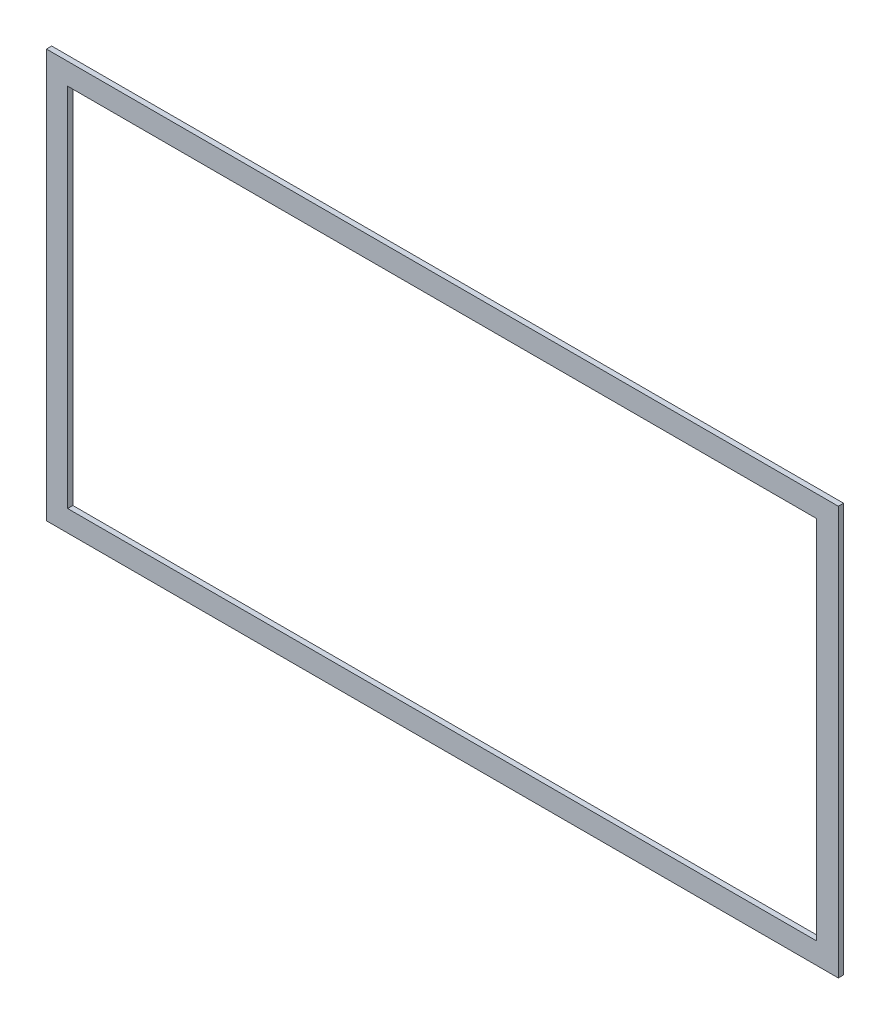
ISO-10303-21;
HEADER;
FILE_DESCRIPTION(('STEP AP214'),'2;1');
FILE_NAME('part.step','',(''),(''),'','','');
FILE_SCHEMA(('AUTOMOTIVE_DESIGN { 1 0 10303 214 1 1 1 1 }'));
ENDSEC;
DATA;
#1=APPLICATION_CONTEXT('core data for automotive mechanical design processes');
#2=APPLICATION_PROTOCOL_DEFINITION('international standard','automotive_design',2000,#1);
#3=PRODUCT_CONTEXT('',#1,'mechanical');
#4=PRODUCT('Part','Part','',(#3));
#5=PRODUCT_RELATED_PRODUCT_CATEGORY('part','',(#4));
#6=PRODUCT_DEFINITION_FORMATION('','',#4);
#7=PRODUCT_DEFINITION_CONTEXT('part definition',#1,'design');
#8=PRODUCT_DEFINITION('design','',#6,#7);
#9=PRODUCT_DEFINITION_SHAPE('','',#8);
#10=(LENGTH_UNIT() NAMED_UNIT(*) SI_UNIT(.MILLI.,.METRE.));
#11=(NAMED_UNIT(*) PLANE_ANGLE_UNIT() SI_UNIT($,.RADIAN.));
#12=(NAMED_UNIT(*) SI_UNIT($,.STERADIAN.) SOLID_ANGLE_UNIT());
#13=UNCERTAINTY_MEASURE_WITH_UNIT(LENGTH_MEASURE(1.E-05),#10,'distance_accuracy_value','');
#14=(GEOMETRIC_REPRESENTATION_CONTEXT(3) GLOBAL_UNCERTAINTY_ASSIGNED_CONTEXT((#13)) GLOBAL_UNIT_ASSIGNED_CONTEXT((#10,
#11,#12)) REPRESENTATION_CONTEXT('',''));
#15=CARTESIAN_POINT('',(0.,0.,0.));
#16=DIRECTION('',(0.,0.,1.));
#17=DIRECTION('',(1.,0.,0.));
#18=AXIS2_PLACEMENT_3D('',#15,#16,#17);
#19=CARTESIAN_POINT('',(0.,0.,0.05));
#20=DIRECTION('',(0.,0.,1.));
#21=DIRECTION('',(1.,0.,0.));
#22=AXIS2_PLACEMENT_3D('',#19,#20,#21);
#23=PLANE('',#22);
#24=DIRECTION('',(1.,0.,0.));
#25=VECTOR('',#24,1.);
#26=CARTESIAN_POINT('',(0.360426,3.83032,0.05));
#27=LINE('',#26,#25);
#28=CARTESIAN_POINT('',(7.502652,3.83032,0.05));
#29=VERTEX_POINT('',#28);
#30=CARTESIAN_POINT('',(0.360426,3.83032,0.05));
#31=VERTEX_POINT('',#30);
#32=EDGE_CURVE('E122',#29,#31,#27,.F.);
#33=ORIENTED_EDGE('',*,*,#32,.F.);
#34=DIRECTION('',(0.,1.,0.));
#35=VECTOR('',#34,1.);
#36=CARTESIAN_POINT('',(7.502652,3.83032,0.05));
#37=LINE('',#36,#35);
#38=CARTESIAN_POINT('',(7.502652,0.342138,0.05));
#39=VERTEX_POINT('',#38);
#40=EDGE_CURVE('E109',#39,#29,#37,.T.);
#41=ORIENTED_EDGE('',*,*,#40,.F.);
#42=DIRECTION('',(1.,0.,0.));
#43=VECTOR('',#42,1.);
#44=CARTESIAN_POINT('',(7.502652,0.342138,0.05));
#45=LINE('',#44,#43);
#46=CARTESIAN_POINT('',(0.360426,0.342138,0.05));
#47=VERTEX_POINT('',#46);
#48=EDGE_CURVE('E111',#47,#39,#45,.T.);
#49=ORIENTED_EDGE('',*,*,#48,.F.);
#50=DIRECTION('',(0.,1.,0.));
#51=VECTOR('',#50,1.);
#52=CARTESIAN_POINT('',(0.360426,0.342138,0.05));
#53=LINE('',#52,#51);
#54=EDGE_CURVE('E115',#31,#47,#53,.F.);
#55=ORIENTED_EDGE('',*,*,#54,.F.);
#56=EDGE_LOOP('',(#33,#41,#49,#55));
#57=FACE_BOUND('',#56,.T.);
#58=DIRECTION('',(1.,0.,0.));
#59=VECTOR('',#58,1.);
#60=CARTESIAN_POINT('',(7.71017,4.035806,0.05));
#61=LINE('',#60,#59);
#62=CARTESIAN_POINT('',(0.157988,4.035806,0.05));
#63=VERTEX_POINT('',#62);
#64=CARTESIAN_POINT('',(7.71017,4.035806,0.05));
#65=VERTEX_POINT('',#64);
#66=EDGE_CURVE('E93',#63,#65,#61,.T.);
#67=ORIENTED_EDGE('',*,*,#66,.F.);
#68=DIRECTION('',(0.,1.,0.));
#69=VECTOR('',#68,1.);
#70=CARTESIAN_POINT('',(0.157988,4.035806,0.05));
#71=LINE('',#70,#69);
#72=CARTESIAN_POINT('',(0.157988,0.1397,0.05));
#73=VERTEX_POINT('',#72);
#74=EDGE_CURVE('E20',#73,#63,#71,.T.);
#75=ORIENTED_EDGE('',*,*,#74,.F.);
#76=DIRECTION('',(1.,0.,0.));
#77=VECTOR('',#76,1.);
#78=CARTESIAN_POINT('',(0.157988,0.1397,0.05));
#79=LINE('',#78,#77);
#80=CARTESIAN_POINT('',(7.71017,0.1397,0.05));
#81=VERTEX_POINT('',#80);
#82=EDGE_CURVE('E83',#81,#73,#79,.F.);
#83=ORIENTED_EDGE('',*,*,#82,.F.);
#84=DIRECTION('',(0.,1.,0.));
#85=VECTOR('',#84,1.);
#86=CARTESIAN_POINT('',(7.71017,0.1397,0.05));
#87=LINE('',#86,#85);
#88=EDGE_CURVE('E78',#65,#81,#87,.F.);
#89=ORIENTED_EDGE('',*,*,#88,.F.);
#90=EDGE_LOOP('',(#67,#75,#83,#89));
#91=FACE_BOUND('',#90,.T.);
#92=ADVANCED_FACE('F17',(#57,#91),#23,.T.);
#93=CARTESIAN_POINT('',(0.157988,4.035806,0.));
#94=DIRECTION('',(-1.,0.,0.));
#95=DIRECTION('',(0.,0.,1.));
#96=AXIS2_PLACEMENT_3D('',#93,#94,#95);
#97=PLANE('',#96);
#98=DIRECTION('',(0.,0.,1.));
#99=VECTOR('',#98,1.);
#100=CARTESIAN_POINT('',(0.157988,4.035806,0.));
#101=LINE('',#100,#99);
#102=CARTESIAN_POINT('',(0.157988,4.035806,0.));
#103=VERTEX_POINT('',#102);
#104=EDGE_CURVE('E104',#103,#63,#101,.T.);
#105=ORIENTED_EDGE('',*,*,#104,.F.);
#106=DIRECTION('',(0.,1.,0.));
#107=VECTOR('',#106,1.);
#108=CARTESIAN_POINT('',(0.157988,0.,0.));
#109=LINE('',#108,#107);
#110=CARTESIAN_POINT('',(0.157988,0.1397,0.));
#111=VERTEX_POINT('',#110);
#112=EDGE_CURVE('E99',#103,#111,#109,.F.);
#113=ORIENTED_EDGE('',*,*,#112,.T.);
#114=DIRECTION('',(0.,0.,-1.));
#115=VECTOR('',#114,1.);
#116=CARTESIAN_POINT('',(0.157988,0.1397,0.));
#117=LINE('',#116,#115);
#118=EDGE_CURVE('E88',#73,#111,#117,.T.);
#119=ORIENTED_EDGE('',*,*,#118,.F.);
#120=ORIENTED_EDGE('',*,*,#74,.T.);
#121=EDGE_LOOP('',(#105,#113,#119,#120));
#122=FACE_BOUND('',#121,.T.);
#123=ADVANCED_FACE('F98',(#122),#97,.T.);
#124=CARTESIAN_POINT('',(0.157988,0.1397,0.));
#125=DIRECTION('',(0.,-1.,0.));
#126=DIRECTION('',(0.,0.,-1.));
#127=AXIS2_PLACEMENT_3D('',#124,#125,#126);
#128=PLANE('',#127);
#129=ORIENTED_EDGE('',*,*,#118,.T.);
#130=DIRECTION('',(1.,0.,0.));
#131=VECTOR('',#130,1.);
#132=CARTESIAN_POINT('',(0.,0.1397,0.));
#133=LINE('',#132,#131);
#134=CARTESIAN_POINT('',(7.71017,0.1397,0.));
#135=VERTEX_POINT('',#134);
#136=EDGE_CURVE('E126',#111,#135,#133,.T.);
#137=ORIENTED_EDGE('',*,*,#136,.T.);
#138=DIRECTION('',(0.,0.,-1.));
#139=VECTOR('',#138,1.);
#140=CARTESIAN_POINT('',(7.71017,0.1397,0.));
#141=LINE('',#140,#139);
#142=EDGE_CURVE('E90',#81,#135,#141,.T.);
#143=ORIENTED_EDGE('',*,*,#142,.F.);
#144=ORIENTED_EDGE('',*,*,#82,.T.);
#145=EDGE_LOOP('',(#129,#137,#143,#144));
#146=FACE_BOUND('',#145,.T.);
#147=ADVANCED_FACE('F85',(#146),#128,.T.);
#148=CARTESIAN_POINT('',(7.71017,0.1397,0.));
#149=DIRECTION('',(1.,0.,0.));
#150=DIRECTION('',(0.,0.,-1.));
#151=AXIS2_PLACEMENT_3D('',#148,#149,#150);
#152=PLANE('',#151);
#153=ORIENTED_EDGE('',*,*,#142,.T.);
#154=DIRECTION('',(0.,1.,0.));
#155=VECTOR('',#154,1.);
#156=CARTESIAN_POINT('',(7.71017,0.,0.));
#157=LINE('',#156,#155);
#158=CARTESIAN_POINT('',(7.71017,4.035806,0.));
#159=VERTEX_POINT('',#158);
#160=EDGE_CURVE('E128',#135,#159,#157,.T.);
#161=ORIENTED_EDGE('',*,*,#160,.T.);
#162=DIRECTION('',(0.,0.,1.));
#163=VECTOR('',#162,1.);
#164=CARTESIAN_POINT('',(7.71017,4.035806,0.));
#165=LINE('',#164,#163);
#166=EDGE_CURVE('E107',#65,#159,#165,.F.);
#167=ORIENTED_EDGE('',*,*,#166,.F.);
#168=ORIENTED_EDGE('',*,*,#88,.T.);
#169=EDGE_LOOP('',(#153,#161,#167,#168));
#170=FACE_BOUND('',#169,.T.);
#171=ADVANCED_FACE('F176',(#170),#152,.T.);
#172=CARTESIAN_POINT('',(7.71017,4.035806,0.));
#173=DIRECTION('',(0.,1.,0.));
#174=DIRECTION('',(0.,0.,1.));
#175=AXIS2_PLACEMENT_3D('',#172,#173,#174);
#176=PLANE('',#175);
#177=ORIENTED_EDGE('',*,*,#166,.T.);
#178=DIRECTION('',(1.,0.,0.));
#179=VECTOR('',#178,1.);
#180=CARTESIAN_POINT('',(0.,4.035806,0.));
#181=LINE('',#180,#179);
#182=EDGE_CURVE('E131',#159,#103,#181,.F.);
#183=ORIENTED_EDGE('',*,*,#182,.T.);
#184=ORIENTED_EDGE('',*,*,#104,.T.);
#185=ORIENTED_EDGE('',*,*,#66,.T.);
#186=EDGE_LOOP('',(#177,#183,#184,#185));
#187=FACE_BOUND('',#186,.T.);
#188=ADVANCED_FACE('F173',(#187),#176,.T.);
#189=CARTESIAN_POINT('',(7.502652,3.83032,0.));
#190=DIRECTION('',(-1.,0.,0.));
#191=DIRECTION('',(0.,0.,1.));
#192=AXIS2_PLACEMENT_3D('',#189,#190,#191);
#193=PLANE('',#192);
#194=DIRECTION('',(0.,0.,-1.));
#195=VECTOR('',#194,1.);
#196=CARTESIAN_POINT('',(7.502652,3.83032,0.));
#197=LINE('',#196,#195);
#198=CARTESIAN_POINT('',(7.502652,3.83032,0.));
#199=VERTEX_POINT('',#198);
#200=EDGE_CURVE('E119',#199,#29,#197,.F.);
#201=ORIENTED_EDGE('',*,*,#200,.F.);
#202=DIRECTION('',(0.,1.,0.));
#203=VECTOR('',#202,1.);
#204=CARTESIAN_POINT('',(7.502652,0.,0.));
#205=LINE('',#204,#203);
#206=CARTESIAN_POINT('',(7.502652,0.342138,0.));
#207=VERTEX_POINT('',#206);
#208=EDGE_CURVE('E134',#199,#207,#205,.F.);
#209=ORIENTED_EDGE('',*,*,#208,.T.);
#210=DIRECTION('',(0.,0.,1.));
#211=VECTOR('',#210,1.);
#212=CARTESIAN_POINT('',(7.502652,0.342138,0.));
#213=LINE('',#212,#211);
#214=EDGE_CURVE('E113',#39,#207,#213,.F.);
#215=ORIENTED_EDGE('',*,*,#214,.F.);
#216=ORIENTED_EDGE('',*,*,#40,.T.);
#217=EDGE_LOOP('',(#201,#209,#215,#216));
#218=FACE_BOUND('',#217,.T.);
#219=ADVANCED_FACE('F156',(#218),#193,.T.);
#220=CARTESIAN_POINT('',(7.502652,0.342138,0.));
#221=DIRECTION('',(0.,1.,0.));
#222=DIRECTION('',(0.,0.,1.));
#223=AXIS2_PLACEMENT_3D('',#220,#221,#222);
#224=PLANE('',#223);
#225=ORIENTED_EDGE('',*,*,#214,.T.);
#226=DIRECTION('',(1.,0.,0.));
#227=VECTOR('',#226,1.);
#228=CARTESIAN_POINT('',(0.,0.342138,0.));
#229=LINE('',#228,#227);
#230=CARTESIAN_POINT('',(0.360426,0.342138,0.));
#231=VERTEX_POINT('',#230);
#232=EDGE_CURVE('E137',#207,#231,#229,.F.);
#233=ORIENTED_EDGE('',*,*,#232,.T.);
#234=DIRECTION('',(0.,0.,-1.));
#235=VECTOR('',#234,1.);
#236=CARTESIAN_POINT('',(0.360426,0.342138,0.));
#237=LINE('',#236,#235);
#238=EDGE_CURVE('E117',#47,#231,#237,.T.);
#239=ORIENTED_EDGE('',*,*,#238,.F.);
#240=ORIENTED_EDGE('',*,*,#48,.T.);
#241=EDGE_LOOP('',(#225,#233,#239,#240));
#242=FACE_BOUND('',#241,.T.);
#243=ADVANCED_FACE('F150',(#242),#224,.T.);
#244=CARTESIAN_POINT('',(0.360426,0.342138,0.));
#245=DIRECTION('',(1.,0.,0.));
#246=DIRECTION('',(0.,0.,-1.));
#247=AXIS2_PLACEMENT_3D('',#244,#245,#246);
#248=PLANE('',#247);
#249=ORIENTED_EDGE('',*,*,#238,.T.);
#250=DIRECTION('',(0.,1.,0.));
#251=VECTOR('',#250,1.);
#252=CARTESIAN_POINT('',(0.360426,0.,0.));
#253=LINE('',#252,#251);
#254=CARTESIAN_POINT('',(0.360426,3.83032,0.));
#255=VERTEX_POINT('',#254);
#256=EDGE_CURVE('E26',#231,#255,#253,.T.);
#257=ORIENTED_EDGE('',*,*,#256,.T.);
#258=DIRECTION('',(0.,0.,-1.));
#259=VECTOR('',#258,1.);
#260=CARTESIAN_POINT('',(0.360426,3.83032,0.));
#261=LINE('',#260,#259);
#262=EDGE_CURVE('E34',#31,#255,#261,.T.);
#263=ORIENTED_EDGE('',*,*,#262,.F.);
#264=ORIENTED_EDGE('',*,*,#54,.T.);
#265=EDGE_LOOP('',(#249,#257,#263,#264));
#266=FACE_BOUND('',#265,.T.);
#267=ADVANCED_FACE('F143',(#266),#248,.T.);
#268=CARTESIAN_POINT('',(0.360426,3.83032,0.));
#269=DIRECTION('',(0.,-1.,0.));
#270=DIRECTION('',(0.,0.,-1.));
#271=AXIS2_PLACEMENT_3D('',#268,#269,#270);
#272=PLANE('',#271);
#273=ORIENTED_EDGE('',*,*,#262,.T.);
#274=DIRECTION('',(1.,0.,0.));
#275=VECTOR('',#274,1.);
#276=CARTESIAN_POINT('',(0.,3.83032,0.));
#277=LINE('',#276,#275);
#278=EDGE_CURVE('E11',#255,#199,#277,.T.);
#279=ORIENTED_EDGE('',*,*,#278,.T.);
#280=ORIENTED_EDGE('',*,*,#200,.T.);
#281=ORIENTED_EDGE('',*,*,#32,.T.);
#282=EDGE_LOOP('',(#273,#279,#280,#281));
#283=FACE_BOUND('',#282,.T.);
#284=ADVANCED_FACE('F158',(#283),#272,.T.);
#285=CARTESIAN_POINT('',(0.,0.,0.));
#286=DIRECTION('',(0.,0.,1.));
#287=DIRECTION('',(1.,0.,0.));
#288=AXIS2_PLACEMENT_3D('',#285,#286,#287);
#289=PLANE('',#288);
#290=ORIENTED_EDGE('',*,*,#256,.F.);
#291=ORIENTED_EDGE('',*,*,#232,.F.);
#292=ORIENTED_EDGE('',*,*,#208,.F.);
#293=ORIENTED_EDGE('',*,*,#278,.F.);
#294=EDGE_LOOP('',(#290,#291,#292,#293));
#295=FACE_BOUND('',#294,.T.);
#296=ORIENTED_EDGE('',*,*,#160,.F.);
#297=ORIENTED_EDGE('',*,*,#136,.F.);
#298=ORIENTED_EDGE('',*,*,#112,.F.);
#299=ORIENTED_EDGE('',*,*,#182,.F.);
#300=EDGE_LOOP('',(#296,#297,#298,#299));
#301=FACE_BOUND('',#300,.T.);
#302=ADVANCED_FACE('F147',(#295,#301),#289,.F.);
#303=CLOSED_SHELL('',(#92,#123,#147,#171,#188,#219,#243,#267,#284,#302));
#304=MANIFOLD_SOLID_BREP('B1',#303);
#305=ADVANCED_BREP_SHAPE_REPRESENTATION('',(#18,#304),#14);
#306=SHAPE_DEFINITION_REPRESENTATION(#9,#305);
ENDSEC;
END-ISO-10303-21;
